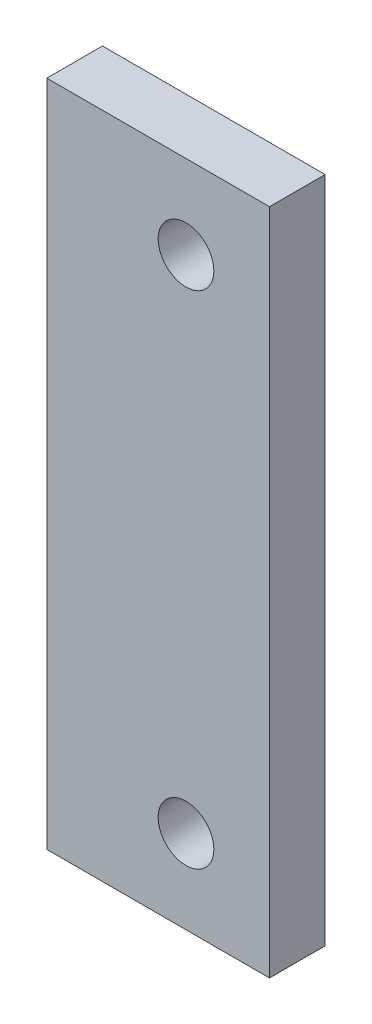
ISO-10303-21;
HEADER;
FILE_DESCRIPTION(('STEP AP214'),'2;1');
FILE_NAME('part.step','',(''),(''),'','','');
FILE_SCHEMA(('AUTOMOTIVE_DESIGN { 1 0 10303 214 1 1 1 1 }'));
ENDSEC;
DATA;
#1=APPLICATION_CONTEXT('core data for automotive mechanical design processes');
#2=APPLICATION_PROTOCOL_DEFINITION('international standard','automotive_design',2000,#1);
#3=PRODUCT_CONTEXT('',#1,'mechanical');
#4=PRODUCT('Part','Part','',(#3));
#5=PRODUCT_RELATED_PRODUCT_CATEGORY('part','',(#4));
#6=PRODUCT_DEFINITION_FORMATION('','',#4);
#7=PRODUCT_DEFINITION_CONTEXT('part definition',#1,'design');
#8=PRODUCT_DEFINITION('design','',#6,#7);
#9=PRODUCT_DEFINITION_SHAPE('','',#8);
#10=(LENGTH_UNIT() NAMED_UNIT(*) SI_UNIT(.MILLI.,.METRE.));
#11=(NAMED_UNIT(*) PLANE_ANGLE_UNIT() SI_UNIT($,.RADIAN.));
#12=(NAMED_UNIT(*) SI_UNIT($,.STERADIAN.) SOLID_ANGLE_UNIT());
#13=UNCERTAINTY_MEASURE_WITH_UNIT(LENGTH_MEASURE(1.E-05),#10,'distance_accuracy_value','');
#14=(GEOMETRIC_REPRESENTATION_CONTEXT(3) GLOBAL_UNCERTAINTY_ASSIGNED_CONTEXT((#13)) GLOBAL_UNIT_ASSIGNED_CONTEXT((#10,
#11,#12)) REPRESENTATION_CONTEXT('',''));
#15=CARTESIAN_POINT('',(0.,0.,0.));
#16=DIRECTION('',(0.,0.,1.));
#17=DIRECTION('',(1.,0.,0.));
#18=AXIS2_PLACEMENT_3D('',#15,#16,#17);
#19=CARTESIAN_POINT('',(0.,0.,10.));
#20=DIRECTION('',(0.,0.,-1.));
#21=DIRECTION('',(-1.,0.,0.));
#22=AXIS2_PLACEMENT_3D('',#19,#20,#21);
#23=PLANE('',#22);
#24=CARTESIAN_POINT('',(14.9999999999999,-255.,10.));
#25=DIRECTION('',(0.,0.,1.));
#26=DIRECTION('',(1.,0.,0.));
#27=AXIS2_PLACEMENT_3D('',#24,#25,#26);
#28=CIRCLE('',#27,5.);
#29=CARTESIAN_POINT('',(19.9999999999999,-255.,10.));
#30=VERTEX_POINT('',#29);
#31=EDGE_CURVE('E103',#30,#30,#28,.T.);
#32=ORIENTED_EDGE('',*,*,#31,.F.);
#33=EDGE_LOOP('',(#32));
#34=FACE_BOUND('',#33,.T.);
#35=DIRECTION('',(0.,1.,0.));
#36=VECTOR('',#35,1.);
#37=CARTESIAN_POINT('',(30.,-240.,10.));
#38=LINE('',#37,#36);
#39=CARTESIAN_POINT('',(30.,-360.,10.));
#40=VERTEX_POINT('',#39);
#41=CARTESIAN_POINT('',(30.,-240.,10.));
#42=VERTEX_POINT('',#41);
#43=EDGE_CURVE('E88',#40,#42,#38,.T.);
#44=ORIENTED_EDGE('',*,*,#43,.T.);
#45=DIRECTION('',(-1.,0.,0.));
#46=VECTOR('',#45,1.);
#47=CARTESIAN_POINT('',(30.,-240.,10.));
#48=LINE('',#47,#46);
#49=CARTESIAN_POINT('',(-9.99999999999997,-240.,10.));
#50=VERTEX_POINT('',#49);
#51=EDGE_CURVE('E83',#42,#50,#48,.T.);
#52=ORIENTED_EDGE('',*,*,#51,.T.);
#53=DIRECTION('',(0.,-1.,0.));
#54=VECTOR('',#53,1.);
#55=CARTESIAN_POINT('',(-9.99999999999997,-240.,10.));
#56=LINE('',#55,#54);
#57=CARTESIAN_POINT('',(-9.99999999999996,-360.,10.));
#58=VERTEX_POINT('',#57);
#59=EDGE_CURVE('E86',#50,#58,#56,.T.);
#60=ORIENTED_EDGE('',*,*,#59,.T.);
#61=DIRECTION('',(1.,0.,0.));
#62=VECTOR('',#61,1.);
#63=CARTESIAN_POINT('',(30.,-360.,10.));
#64=LINE('',#63,#62);
#65=EDGE_CURVE('E53',#58,#40,#64,.T.);
#66=ORIENTED_EDGE('',*,*,#65,.T.);
#67=EDGE_LOOP('',(#44,#52,#60,#66));
#68=FACE_BOUND('',#67,.T.);
#69=CARTESIAN_POINT('',(14.9999999999999,-345.,10.));
#70=DIRECTION('',(0.,0.,1.));
#71=DIRECTION('',(1.,0.,0.));
#72=AXIS2_PLACEMENT_3D('',#69,#70,#71);
#73=CIRCLE('',#72,5.);
#74=CARTESIAN_POINT('',(19.9999999999999,-345.,10.));
#75=VERTEX_POINT('',#74);
#76=EDGE_CURVE('E118',#75,#75,#73,.T.);
#77=ORIENTED_EDGE('',*,*,#76,.F.);
#78=EDGE_LOOP('',(#77));
#79=FACE_BOUND('',#78,.T.);
#80=ADVANCED_FACE('F36',(#34,#68,#79),#23,.F.);
#81=CARTESIAN_POINT('',(0.,0.,0.));
#82=DIRECTION('',(0.,0.,-1.));
#83=DIRECTION('',(-1.,0.,0.));
#84=AXIS2_PLACEMENT_3D('',#81,#82,#83);
#85=PLANE('',#84);
#86=CARTESIAN_POINT('',(14.9999999999999,-255.,0.));
#87=DIRECTION('',(0.,0.,1.));
#88=DIRECTION('',(1.,0.,0.));
#89=AXIS2_PLACEMENT_3D('',#86,#87,#88);
#90=CIRCLE('',#89,5.);
#91=CARTESIAN_POINT('',(19.9999999999999,-255.,0.));
#92=VERTEX_POINT('',#91);
#93=EDGE_CURVE('E115',#92,#92,#90,.T.);
#94=ORIENTED_EDGE('',*,*,#93,.T.);
#95=EDGE_LOOP('',(#94));
#96=FACE_BOUND('',#95,.T.);
#97=DIRECTION('',(0.,1.,0.));
#98=VECTOR('',#97,1.);
#99=CARTESIAN_POINT('',(30.,-240.,0.));
#100=LINE('',#99,#98);
#101=CARTESIAN_POINT('',(30.,-360.,0.));
#102=VERTEX_POINT('',#101);
#103=CARTESIAN_POINT('',(30.,-240.,0.));
#104=VERTEX_POINT('',#103);
#105=EDGE_CURVE('E100',#102,#104,#100,.T.);
#106=ORIENTED_EDGE('',*,*,#105,.F.);
#107=DIRECTION('',(1.,0.,0.));
#108=VECTOR('',#107,1.);
#109=CARTESIAN_POINT('',(30.,-360.,0.));
#110=LINE('',#109,#108);
#111=CARTESIAN_POINT('',(-9.99999999999996,-360.,0.));
#112=VERTEX_POINT('',#111);
#113=EDGE_CURVE('E76',#112,#102,#110,.T.);
#114=ORIENTED_EDGE('',*,*,#113,.F.);
#115=DIRECTION('',(0.,-1.,0.));
#116=VECTOR('',#115,1.);
#117=CARTESIAN_POINT('',(-9.99999999999997,-240.,0.));
#118=LINE('',#117,#116);
#119=CARTESIAN_POINT('',(-9.99999999999997,-240.,0.));
#120=VERTEX_POINT('',#119);
#121=EDGE_CURVE('E70',#120,#112,#118,.T.);
#122=ORIENTED_EDGE('',*,*,#121,.F.);
#123=DIRECTION('',(-1.,0.,0.));
#124=VECTOR('',#123,1.);
#125=CARTESIAN_POINT('',(30.,-240.,0.));
#126=LINE('',#125,#124);
#127=EDGE_CURVE('E92',#104,#120,#126,.T.);
#128=ORIENTED_EDGE('',*,*,#127,.F.);
#129=EDGE_LOOP('',(#106,#114,#122,#128));
#130=FACE_BOUND('',#129,.T.);
#131=CARTESIAN_POINT('',(14.9999999999999,-345.,0.));
#132=DIRECTION('',(0.,0.,1.));
#133=DIRECTION('',(1.,0.,0.));
#134=AXIS2_PLACEMENT_3D('',#131,#132,#133);
#135=CIRCLE('',#134,5.);
#136=CARTESIAN_POINT('',(19.9999999999999,-345.,0.));
#137=VERTEX_POINT('',#136);
#138=EDGE_CURVE('E121',#137,#137,#135,.T.);
#139=ORIENTED_EDGE('',*,*,#138,.T.);
#140=EDGE_LOOP('',(#139));
#141=FACE_BOUND('',#140,.T.);
#142=ADVANCED_FACE('F111',(#96,#130,#141),#85,.T.);
#143=CARTESIAN_POINT('',(30.,-240.,10.));
#144=DIRECTION('',(-1.,0.,0.));
#145=DIRECTION('',(0.,-1.,0.));
#146=AXIS2_PLACEMENT_3D('',#143,#144,#145);
#147=PLANE('',#146);
#148=ORIENTED_EDGE('',*,*,#105,.T.);
#149=DIRECTION('',(0.,0.,-1.));
#150=VECTOR('',#149,1.);
#151=CARTESIAN_POINT('',(30.,-240.,10.));
#152=LINE('',#151,#150);
#153=EDGE_CURVE('E11',#42,#104,#152,.T.);
#154=ORIENTED_EDGE('',*,*,#153,.F.);
#155=ORIENTED_EDGE('',*,*,#43,.F.);
#156=DIRECTION('',(0.,0.,-1.));
#157=VECTOR('',#156,1.);
#158=CARTESIAN_POINT('',(30.,-360.,10.));
#159=LINE('',#158,#157);
#160=EDGE_CURVE('E96',#40,#102,#159,.T.);
#161=ORIENTED_EDGE('',*,*,#160,.T.);
#162=EDGE_LOOP('',(#148,#154,#155,#161));
#163=FACE_BOUND('',#162,.T.);
#164=ADVANCED_FACE('F38',(#163),#147,.F.);
#165=CARTESIAN_POINT('',(30.,-240.,10.));
#166=DIRECTION('',(0.,-1.,0.));
#167=DIRECTION('',(0.,0.,-1.));
#168=AXIS2_PLACEMENT_3D('',#165,#166,#167);
#169=PLANE('',#168);
#170=ORIENTED_EDGE('',*,*,#127,.T.);
#171=DIRECTION('',(0.,0.,-1.));
#172=VECTOR('',#171,1.);
#173=CARTESIAN_POINT('',(-9.99999999999997,-240.,10.));
#174=LINE('',#173,#172);
#175=EDGE_CURVE('E45',#50,#120,#174,.T.);
#176=ORIENTED_EDGE('',*,*,#175,.F.);
#177=ORIENTED_EDGE('',*,*,#51,.F.);
#178=ORIENTED_EDGE('',*,*,#153,.T.);
#179=EDGE_LOOP('',(#170,#176,#177,#178));
#180=FACE_BOUND('',#179,.T.);
#181=ADVANCED_FACE('F91',(#180),#169,.F.);
#182=CARTESIAN_POINT('',(-9.99999999999997,-240.,10.));
#183=DIRECTION('',(1.,0.,0.));
#184=DIRECTION('',(0.,1.,0.));
#185=AXIS2_PLACEMENT_3D('',#182,#183,#184);
#186=PLANE('',#185);
#187=ORIENTED_EDGE('',*,*,#121,.T.);
#188=DIRECTION('',(0.,0.,-1.));
#189=VECTOR('',#188,1.);
#190=CARTESIAN_POINT('',(-9.99999999999996,-360.,10.));
#191=LINE('',#190,#189);
#192=EDGE_CURVE('E93',#58,#112,#191,.T.);
#193=ORIENTED_EDGE('',*,*,#192,.F.);
#194=ORIENTED_EDGE('',*,*,#59,.F.);
#195=ORIENTED_EDGE('',*,*,#175,.T.);
#196=EDGE_LOOP('',(#187,#193,#194,#195));
#197=FACE_BOUND('',#196,.T.);
#198=ADVANCED_FACE('F94',(#197),#186,.F.);
#199=CARTESIAN_POINT('',(30.,-360.,10.));
#200=DIRECTION('',(0.,1.,0.));
#201=DIRECTION('',(0.,0.,1.));
#202=AXIS2_PLACEMENT_3D('',#199,#200,#201);
#203=PLANE('',#202);
#204=ORIENTED_EDGE('',*,*,#113,.T.);
#205=ORIENTED_EDGE('',*,*,#160,.F.);
#206=ORIENTED_EDGE('',*,*,#65,.F.);
#207=ORIENTED_EDGE('',*,*,#192,.T.);
#208=EDGE_LOOP('',(#204,#205,#206,#207));
#209=FACE_BOUND('',#208,.T.);
#210=ADVANCED_FACE('F108',(#209),#203,.F.);
#211=CARTESIAN_POINT('',(14.9999999999999,-255.,10.));
#212=DIRECTION('',(0.,0.,-1.));
#213=DIRECTION('',(-1.,0.,0.));
#214=AXIS2_PLACEMENT_3D('',#211,#212,#213);
#215=CYLINDRICAL_SURFACE('',#214,5.);
#216=ORIENTED_EDGE('',*,*,#31,.T.);
#217=EDGE_LOOP('',(#216));
#218=FACE_BOUND('',#217,.T.);
#219=ORIENTED_EDGE('',*,*,#93,.F.);
#220=EDGE_LOOP('',(#219));
#221=FACE_BOUND('',#220,.T.);
#222=ADVANCED_FACE('F139',(#218,#221),#215,.F.);
#223=CARTESIAN_POINT('',(14.9999999999999,-345.,10.));
#224=DIRECTION('',(0.,0.,-1.));
#225=DIRECTION('',(-1.,0.,0.));
#226=AXIS2_PLACEMENT_3D('',#223,#224,#225);
#227=CYLINDRICAL_SURFACE('',#226,5.);
#228=ORIENTED_EDGE('',*,*,#76,.T.);
#229=EDGE_LOOP('',(#228));
#230=FACE_BOUND('',#229,.T.);
#231=ORIENTED_EDGE('',*,*,#138,.F.);
#232=EDGE_LOOP('',(#231));
#233=FACE_BOUND('',#232,.T.);
#234=ADVANCED_FACE('F127',(#230,#233),#227,.F.);
#235=CLOSED_SHELL('',(#80,#142,#164,#181,#198,#210,#222,#234));
#236=MANIFOLD_SOLID_BREP('B2',#235);
#237=ADVANCED_BREP_SHAPE_REPRESENTATION('',(#18,#236),#14);
#238=SHAPE_DEFINITION_REPRESENTATION(#9,#237);
ENDSEC;
END-ISO-10303-21;
